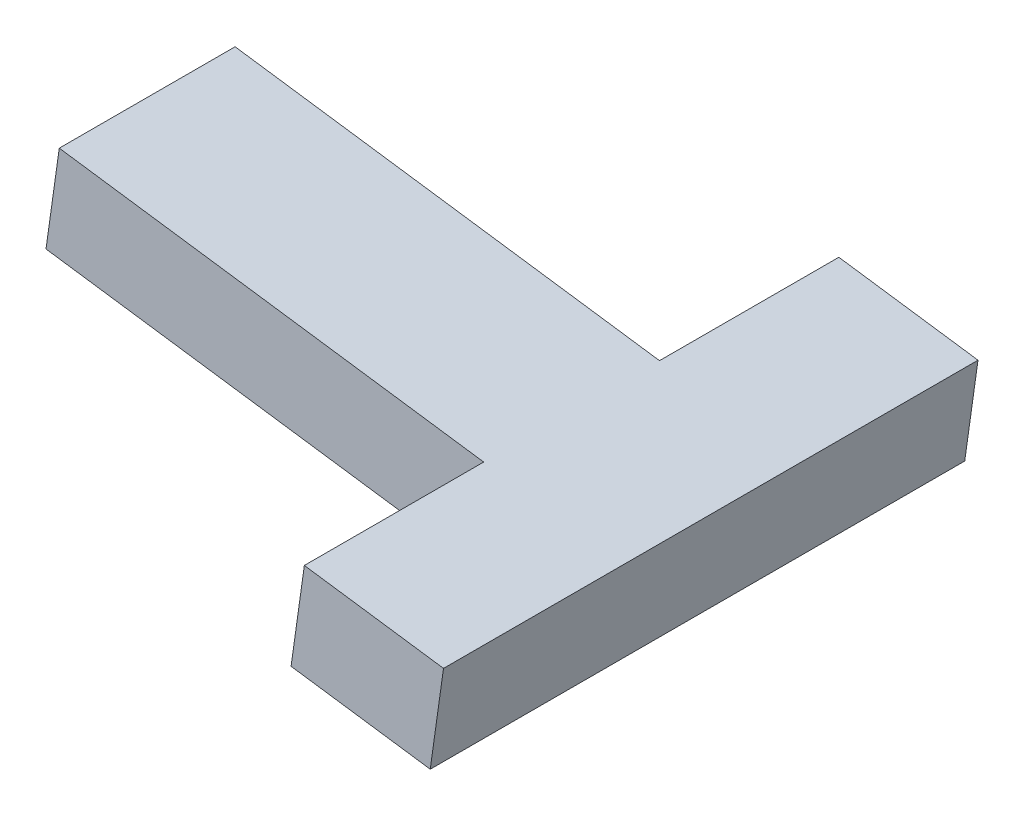
ISO-10303-21;
HEADER;
FILE_DESCRIPTION(('STEP AP214'),'2;1');
FILE_NAME('part.step','',(''),(''),'','','');
FILE_SCHEMA(('AUTOMOTIVE_DESIGN { 1 0 10303 214 1 1 1 1 }'));
ENDSEC;
DATA;
#1=APPLICATION_CONTEXT('core data for automotive mechanical design processes');
#2=APPLICATION_PROTOCOL_DEFINITION('international standard','automotive_design',2000,#1);
#3=PRODUCT_CONTEXT('',#1,'mechanical');
#4=PRODUCT('Part','Part','',(#3));
#5=PRODUCT_RELATED_PRODUCT_CATEGORY('part','',(#4));
#6=PRODUCT_DEFINITION_FORMATION('','',#4);
#7=PRODUCT_DEFINITION_CONTEXT('part definition',#1,'design');
#8=PRODUCT_DEFINITION('design','',#6,#7);
#9=PRODUCT_DEFINITION_SHAPE('','',#8);
#10=(LENGTH_UNIT() NAMED_UNIT(*) SI_UNIT(.MILLI.,.METRE.));
#11=(NAMED_UNIT(*) PLANE_ANGLE_UNIT() SI_UNIT($,.RADIAN.));
#12=(NAMED_UNIT(*) SI_UNIT($,.STERADIAN.) SOLID_ANGLE_UNIT());
#13=UNCERTAINTY_MEASURE_WITH_UNIT(LENGTH_MEASURE(1.E-05),#10,'distance_accuracy_value','');
#14=(GEOMETRIC_REPRESENTATION_CONTEXT(3) GLOBAL_UNCERTAINTY_ASSIGNED_CONTEXT((#13)) GLOBAL_UNIT_ASSIGNED_CONTEXT((#10,
#11,#12)) REPRESENTATION_CONTEXT('',''));
#15=CARTESIAN_POINT('',(0.,0.,0.));
#16=DIRECTION('',(0.,0.,1.));
#17=DIRECTION('',(1.,0.,0.));
#18=AXIS2_PLACEMENT_3D('',#15,#16,#17);
#19=CARTESIAN_POINT('',(740.156751872929,632.005300811222,2076.96507163557));
#20=DIRECTION('',(0.990268068741567,-0.139173100960088,0.));
#21=DIRECTION('',(-0.000106014336864278,-0.000754331202662602,-0.999999709872657));
#22=AXIS2_PLACEMENT_3D('',#19,#20,#21);
#23=PLANE('',#22);
#24=CARTESIAN_POINT('',(738.765021267107,622.102622996844,2076.97268908005));
#25=CARTESIAN_POINT('',(738.768008615167,622.12387908278,2105.15139850353));
#26=CARTESIAN_POINT('',(738.770995963227,622.145135168716,2133.33010792703));
#27=B_SPLINE_CURVE_WITH_KNOTS('',2,(#24,#25,#26),.UNSPECIFIED.,.F.,.F.,(3,3),(0.,1.),.UNSPECIFIED.);
#28=CARTESIAN_POINT('',(738.765021267107,622.102622996844,2076.97268908005));
#29=VERTEX_POINT('',#28);
#30=CARTESIAN_POINT('',(738.770995963227,622.145135168716,2133.33010792703));
#31=VERTEX_POINT('',#30);
#32=EDGE_CURVE('E122',#29,#31,#27,.T.);
#33=ORIENTED_EDGE('',*,*,#32,.F.);
#34=DIRECTION('',(-0.139173060582166,-0.990267781437723,0.000761744447259827));
#35=VECTOR('',#34,1.);
#36=CARTESIAN_POINT('',(740.156751872929,632.005300811222,2076.96507163557));
#37=LINE('',#36,#35);
#38=CARTESIAN_POINT('',(740.156751872929,632.005300811222,2076.96507163557));
#39=VERTEX_POINT('',#38);
#40=EDGE_CURVE('E33',#39,#29,#37,.T.);
#41=ORIENTED_EDGE('',*,*,#40,.F.);
#42=CARTESIAN_POINT('',(740.156751872929,632.005300811222,2076.96507163557));
#43=CARTESIAN_POINT('',(740.159739220989,632.026556897158,2105.14378105907));
#44=CARTESIAN_POINT('',(740.162726569049,632.047812983093,2133.32249048255));
#45=B_SPLINE_CURVE_WITH_KNOTS('',2,(#42,#43,#44),.UNSPECIFIED.,.F.,.F.,(3,3),(0.,1.),.UNSPECIFIED.);
#46=CARTESIAN_POINT('',(740.162726569049,632.047812983093,2133.32249048255));
#47=VERTEX_POINT('',#46);
#48=EDGE_CURVE('E182',#39,#47,#45,.T.);
#49=ORIENTED_EDGE('',*,*,#48,.T.);
#50=DIRECTION('',(-0.139173060582166,-0.990267781437723,0.000761744447259827));
#51=VECTOR('',#50,1.);
#52=CARTESIAN_POINT('',(740.162726569049,632.047812983093,2133.32249048255));
#53=LINE('',#52,#51);
#54=EDGE_CURVE('E11',#47,#31,#53,.T.);
#55=ORIENTED_EDGE('',*,*,#54,.T.);
#56=EDGE_LOOP('',(#33,#41,#49,#55));
#57=FACE_BOUND('',#56,.T.);
#58=ADVANCED_FACE('F17',(#57),#23,.T.);
#59=CARTESIAN_POINT('',(740.162726569049,632.047812983093,2133.32249048255));
#60=DIRECTION('',(0.000106014336864278,0.000754331202662602,0.999999709872657));
#61=DIRECTION('',(0.990268068741567,-0.139173100960088,0.));
#62=AXIS2_PLACEMENT_3D('',#59,#60,#61);
#63=PLANE('',#62);
#64=CARTESIAN_POINT('',(738.770995963227,622.145135168716,2133.33010792703));
#65=CARTESIAN_POINT('',(731.435176572686,623.176117349089,2133.33010792703));
#66=CARTESIAN_POINT('',(724.099357182145,624.207099529462,2133.33010792703));
#67=B_SPLINE_CURVE_WITH_KNOTS('',2,(#64,#65,#66),.UNSPECIFIED.,.F.,.F.,(3,3),(1.,2.),.UNSPECIFIED.);
#68=CARTESIAN_POINT('',(724.099357182145,624.207099529462,2133.33010792703));
#69=VERTEX_POINT('',#68);
#70=EDGE_CURVE('E130',#31,#69,#67,.T.);
#71=ORIENTED_EDGE('',*,*,#70,.F.);
#72=ORIENTED_EDGE('',*,*,#54,.F.);
#73=CARTESIAN_POINT('',(740.162726569049,632.047812983093,2133.32249048255));
#74=CARTESIAN_POINT('',(732.826907178508,633.078795163466,2133.32249048255));
#75=CARTESIAN_POINT('',(725.491087787966,634.109777343839,2133.32249048255));
#76=B_SPLINE_CURVE_WITH_KNOTS('',2,(#73,#74,#75),.UNSPECIFIED.,.F.,.F.,(3,3),(1.,2.),.UNSPECIFIED.);
#77=CARTESIAN_POINT('',(725.491087787966,634.109777343839,2133.32249048255));
#78=VERTEX_POINT('',#77);
#79=EDGE_CURVE('E194',#47,#78,#76,.T.);
#80=ORIENTED_EDGE('',*,*,#79,.T.);
#81=DIRECTION('',(-0.139173060582166,-0.990267781437723,0.000761744447259827));
#82=VECTOR('',#81,1.);
#83=CARTESIAN_POINT('',(725.491087787966,634.109777343839,2133.32249048255));
#84=LINE('',#83,#82);
#85=EDGE_CURVE('E25',#78,#69,#84,.T.);
#86=ORIENTED_EDGE('',*,*,#85,.T.);
#87=EDGE_LOOP('',(#71,#72,#80,#86));
#88=FACE_BOUND('',#87,.T.);
#89=ADVANCED_FACE('F193',(#88),#63,.T.);
#90=CARTESIAN_POINT('',(725.491087787966,634.109777343839,2133.32249048255));
#91=DIRECTION('',(-0.990268068741567,0.139173100960088,0.));
#92=DIRECTION('',(0.000106014336875907,0.000754331202660967,0.999999709872657));
#93=AXIS2_PLACEMENT_3D('',#90,#91,#92);
#94=PLANE('',#93);
#95=CARTESIAN_POINT('',(724.099357182145,624.207099529462,2133.33010792703));
#96=CARTESIAN_POINT('',(724.098354891075,624.199967857928,2123.87581326207));
#97=CARTESIAN_POINT('',(724.097352600004,624.192836186394,2114.4215185971));
#98=B_SPLINE_CURVE_WITH_KNOTS('',2,(#95,#96,#97),.UNSPECIFIED.,.F.,.F.,(3,3),(2.,3.),.UNSPECIFIED.);
#99=CARTESIAN_POINT('',(724.097352600004,624.192836186394,2114.4215185971));
#100=VERTEX_POINT('',#99);
#101=EDGE_CURVE('E138',#69,#100,#98,.T.);
#102=ORIENTED_EDGE('',*,*,#101,.F.);
#103=ORIENTED_EDGE('',*,*,#85,.F.);
#104=CARTESIAN_POINT('',(725.491087787966,634.109777343839,2133.32249048255));
#105=CARTESIAN_POINT('',(725.490085496896,634.102645672305,2123.86819581759));
#106=CARTESIAN_POINT('',(725.489083205826,634.095514000771,2114.41390115263));
#107=B_SPLINE_CURVE_WITH_KNOTS('',2,(#104,#105,#106),.UNSPECIFIED.,.F.,.F.,(3,3),(2.,3.),.UNSPECIFIED.);
#108=CARTESIAN_POINT('',(725.489083205826,634.095514000771,2114.41390115263));
#109=VERTEX_POINT('',#108);
#110=EDGE_CURVE('E203',#78,#109,#107,.T.);
#111=ORIENTED_EDGE('',*,*,#110,.T.);
#112=DIRECTION('',(-0.139173060582166,-0.990267781437723,0.000761744447259827));
#113=VECTOR('',#112,1.);
#114=CARTESIAN_POINT('',(725.489083205826,634.095514000771,2114.41390115263));
#115=LINE('',#114,#113);
#116=EDGE_CURVE('E191',#109,#100,#115,.T.);
#117=ORIENTED_EDGE('',*,*,#116,.T.);
#118=EDGE_LOOP('',(#102,#103,#111,#117));
#119=FACE_BOUND('',#118,.T.);
#120=ADVANCED_FACE('F198',(#119),#94,.T.);
#121=CARTESIAN_POINT('',(725.489083205826,634.095514000771,2114.41390115263));
#122=DIRECTION('',(0.000106014336864278,0.000754331202662602,0.999999709872657));
#123=DIRECTION('',(0.990268068741567,-0.139173100960088,0.));
#124=AXIS2_PLACEMENT_3D('',#121,#122,#123);
#125=PLANE('',#124);
#126=CARTESIAN_POINT('',(724.097352600004,624.192836186394,2114.4215185971));
#127=CARTESIAN_POINT('',(701.725129928298,627.337047034824,2114.4215185971));
#128=CARTESIAN_POINT('',(679.352907256593,630.481257883253,2114.4215185971));
#129=B_SPLINE_CURVE_WITH_KNOTS('',2,(#126,#127,#128),.UNSPECIFIED.,.F.,.F.,(3,3),(3.,4.),.UNSPECIFIED.);
#130=CARTESIAN_POINT('',(679.352907256593,630.481257883253,2114.4215185971));
#131=VERTEX_POINT('',#130);
#132=EDGE_CURVE('E146',#100,#131,#129,.T.);
#133=ORIENTED_EDGE('',*,*,#132,.F.);
#134=ORIENTED_EDGE('',*,*,#116,.F.);
#135=CARTESIAN_POINT('',(725.489083205826,634.095514000771,2114.41390115263));
#136=CARTESIAN_POINT('',(703.11686053412,637.239724849201,2114.41390115263));
#137=CARTESIAN_POINT('',(680.744637862414,640.383935697631,2114.41390115263));
#138=B_SPLINE_CURVE_WITH_KNOTS('',2,(#135,#136,#137),.UNSPECIFIED.,.F.,.F.,(3,3),(3.,4.),.UNSPECIFIED.);
#139=CARTESIAN_POINT('',(680.744637862414,640.383935697631,2114.41390115263));
#140=VERTEX_POINT('',#139);
#141=EDGE_CURVE('E219',#109,#140,#138,.T.);
#142=ORIENTED_EDGE('',*,*,#141,.T.);
#143=DIRECTION('',(-0.139173060582166,-0.990267781437723,0.000761744447259827));
#144=VECTOR('',#143,1.);
#145=CARTESIAN_POINT('',(680.744637862414,640.383935697631,2114.41390115263));
#146=LINE('',#145,#144);
#147=EDGE_CURVE('E189',#140,#131,#146,.T.);
#148=ORIENTED_EDGE('',*,*,#147,.T.);
#149=EDGE_LOOP('',(#133,#134,#142,#148));
#150=FACE_BOUND('',#149,.T.);
#151=ADVANCED_FACE('F239',(#150),#125,.T.);
#152=CARTESIAN_POINT('',(680.744637862414,640.383935697631,2114.41390115263));
#153=DIRECTION('',(-0.990268068741567,0.139173100960088,0.));
#154=DIRECTION('',(0.000106014336858348,0.000754331202663435,0.999999709872657));
#155=AXIS2_PLACEMENT_3D('',#152,#153,#154);
#156=PLANE('',#155);
#157=CARTESIAN_POINT('',(679.352907256593,630.481257883253,2114.4215185971));
#158=CARTESIAN_POINT('',(679.351924490673,630.474265140386,2105.15139850353));
#159=CARTESIAN_POINT('',(679.350941724754,630.467272397518,2095.88127840997));
#160=B_SPLINE_CURVE_WITH_KNOTS('',2,(#157,#158,#159),.UNSPECIFIED.,.F.,.F.,(3,3),(4.,5.),.UNSPECIFIED.);
#161=CARTESIAN_POINT('',(679.350941724754,630.467272397518,2095.88127840997));
#162=VERTEX_POINT('',#161);
#163=EDGE_CURVE('E154',#131,#162,#160,.T.);
#164=ORIENTED_EDGE('',*,*,#163,.F.);
#165=ORIENTED_EDGE('',*,*,#147,.F.);
#166=CARTESIAN_POINT('',(680.744637862414,640.383935697631,2114.41390115263));
#167=CARTESIAN_POINT('',(680.743655096495,640.376942954763,2105.14378105907));
#168=CARTESIAN_POINT('',(680.742672330575,640.369950211895,2095.87366096549));
#169=B_SPLINE_CURVE_WITH_KNOTS('',2,(#166,#167,#168),.UNSPECIFIED.,.F.,.F.,(3,3),(4.,5.),.UNSPECIFIED.);
#170=CARTESIAN_POINT('',(680.742672330575,640.369950211895,2095.87366096549));
#171=VERTEX_POINT('',#170);
#172=EDGE_CURVE('E104',#140,#171,#169,.T.);
#173=ORIENTED_EDGE('',*,*,#172,.T.);
#174=DIRECTION('',(-0.139173060582166,-0.990267781437723,0.000761744447259827));
#175=VECTOR('',#174,1.);
#176=CARTESIAN_POINT('',(680.742672330575,640.369950211895,2095.87366096549));
#177=LINE('',#176,#175);
#178=EDGE_CURVE('E96',#171,#162,#177,.T.);
#179=ORIENTED_EDGE('',*,*,#178,.T.);
#180=EDGE_LOOP('',(#164,#165,#173,#179));
#181=FACE_BOUND('',#180,.T.);
#182=ADVANCED_FACE('F236',(#181),#156,.T.);
#183=CARTESIAN_POINT('',(680.742672330575,640.369950211895,2095.87366096549));
#184=DIRECTION('',(-0.000106014336864278,-0.000754331202662602,-0.999999709872657));
#185=DIRECTION('',(-0.990268068741567,0.139173100960088,0.));
#186=AXIS2_PLACEMENT_3D('',#183,#184,#185);
#187=PLANE('',#186);
#188=CARTESIAN_POINT('',(679.350941724754,630.467272397518,2095.88127840997));
#189=CARTESIAN_POINT('',(701.72316439646,627.323061549088,2095.88127840997));
#190=CARTESIAN_POINT('',(724.095387068165,624.178850700658,2095.88127840997));
#191=B_SPLINE_CURVE_WITH_KNOTS('',2,(#188,#189,#190),.UNSPECIFIED.,.F.,.F.,(3,3),(5.,6.),.UNSPECIFIED.);
#192=CARTESIAN_POINT('',(724.095387068165,624.178850700658,2095.88127840997));
#193=VERTEX_POINT('',#192);
#194=EDGE_CURVE('E162',#162,#193,#191,.T.);
#195=ORIENTED_EDGE('',*,*,#194,.F.);
#196=ORIENTED_EDGE('',*,*,#178,.F.);
#197=CARTESIAN_POINT('',(680.742672330575,640.369950211895,2095.87366096549));
#198=CARTESIAN_POINT('',(703.114895002281,637.225739363465,2095.87366096549));
#199=CARTESIAN_POINT('',(725.487117673987,634.081528515036,2095.87366096549));
#200=B_SPLINE_CURVE_WITH_KNOTS('',2,(#197,#198,#199),.UNSPECIFIED.,.F.,.F.,(3,3),(5.,6.),.UNSPECIFIED.);
#201=CARTESIAN_POINT('',(725.487117673987,634.081528515036,2095.87366096549));
#202=VERTEX_POINT('',#201);
#203=EDGE_CURVE('E99',#171,#202,#200,.T.);
#204=ORIENTED_EDGE('',*,*,#203,.T.);
#205=DIRECTION('',(-0.139173060582166,-0.990267781437723,0.000761744447259827));
#206=VECTOR('',#205,1.);
#207=CARTESIAN_POINT('',(725.487117673987,634.081528515036,2095.87366096549));
#208=LINE('',#207,#206);
#209=EDGE_CURVE('E85',#202,#193,#208,.T.);
#210=ORIENTED_EDGE('',*,*,#209,.T.);
#211=EDGE_LOOP('',(#195,#196,#204,#210));
#212=FACE_BOUND('',#211,.T.);
#213=ADVANCED_FACE('F100',(#212),#187,.T.);
#214=CARTESIAN_POINT('',(725.487117673987,634.081528515036,2095.87366096549));
#215=DIRECTION('',(-0.990268068741567,0.139173100960088,0.));
#216=DIRECTION('',(0.000106014336864278,0.000754331202662602,0.999999709872657));
#217=AXIS2_PLACEMENT_3D('',#214,#215,#216);
#218=PLANE('',#217);
#219=CARTESIAN_POINT('',(724.095387068165,624.178850700658,2095.88127840997));
#220=CARTESIAN_POINT('',(724.094384777095,624.171719029124,2086.426983745));
#221=CARTESIAN_POINT('',(724.093382486025,624.16458735759,2076.97268908005));
#222=B_SPLINE_CURVE_WITH_KNOTS('',2,(#219,#220,#221),.UNSPECIFIED.,.F.,.F.,(3,3),(6.,7.),.UNSPECIFIED.);
#223=CARTESIAN_POINT('',(724.093382486025,624.16458735759,2076.97268908005));
#224=VERTEX_POINT('',#223);
#225=EDGE_CURVE('E92',#193,#224,#222,.T.);
#226=ORIENTED_EDGE('',*,*,#225,.F.);
#227=ORIENTED_EDGE('',*,*,#209,.F.);
#228=CARTESIAN_POINT('',(725.487117673987,634.081528515036,2095.87366096549));
#229=CARTESIAN_POINT('',(725.486115382917,634.074396843501,2086.41936630053));
#230=CARTESIAN_POINT('',(725.485113091847,634.067265171967,2076.96507163557));
#231=B_SPLINE_CURVE_WITH_KNOTS('',2,(#228,#229,#230),.UNSPECIFIED.,.F.,.F.,(3,3),(6.,7.),.UNSPECIFIED.);
#232=CARTESIAN_POINT('',(725.485113091847,634.067265171967,2076.96507163557));
#233=VERTEX_POINT('',#232);
#234=EDGE_CURVE('E89',#202,#233,#231,.T.);
#235=ORIENTED_EDGE('',*,*,#234,.T.);
#236=DIRECTION('',(-0.139173060582166,-0.990267781437723,0.000761744447259827));
#237=VECTOR('',#236,1.);
#238=CARTESIAN_POINT('',(725.485113091847,634.067265171967,2076.96507163557));
#239=LINE('',#238,#237);
#240=EDGE_CURVE('E61',#233,#224,#239,.T.);
#241=ORIENTED_EDGE('',*,*,#240,.T.);
#242=EDGE_LOOP('',(#226,#227,#235,#241));
#243=FACE_BOUND('',#242,.T.);
#244=ADVANCED_FACE('F87',(#243),#218,.T.);
#245=CARTESIAN_POINT('',(725.485113091847,634.067265171967,2076.96507163557));
#246=DIRECTION('',(-0.000106014336864278,-0.000754331202662602,-0.999999709872657));
#247=DIRECTION('',(-0.990268068741567,0.139173100960088,0.));
#248=AXIS2_PLACEMENT_3D('',#245,#246,#247);
#249=PLANE('',#248);
#250=CARTESIAN_POINT('',(724.093382486025,624.16458735759,2076.97268908005));
#251=CARTESIAN_POINT('',(731.429201876566,623.133605177217,2076.97268908005));
#252=CARTESIAN_POINT('',(738.765021267107,622.102622996844,2076.97268908005));
#253=B_SPLINE_CURVE_WITH_KNOTS('',2,(#250,#251,#252),.UNSPECIFIED.,.F.,.F.,(3,3),(7.,8.),.UNSPECIFIED.);
#254=EDGE_CURVE('E175',#224,#29,#253,.T.);
#255=ORIENTED_EDGE('',*,*,#254,.F.);
#256=ORIENTED_EDGE('',*,*,#240,.F.);
#257=CARTESIAN_POINT('',(725.485113091847,634.067265171967,2076.96507163557));
#258=CARTESIAN_POINT('',(732.820932482388,633.036282991595,2076.96507163557));
#259=CARTESIAN_POINT('',(740.156751872929,632.005300811222,2076.96507163557));
#260=B_SPLINE_CURVE_WITH_KNOTS('',2,(#257,#258,#259),.UNSPECIFIED.,.F.,.F.,(3,3),(7.,8.),.UNSPECIFIED.);
#261=EDGE_CURVE('E108',#233,#39,#260,.T.);
#262=ORIENTED_EDGE('',*,*,#261,.T.);
#263=ORIENTED_EDGE('',*,*,#40,.T.);
#264=EDGE_LOOP('',(#255,#256,#262,#263));
#265=FACE_BOUND('',#264,.T.);
#266=ADVANCED_FACE('F294',(#265),#249,.T.);
#267=CARTESIAN_POINT('',(740.159739220989,632.026556897158,2105.14378105907));
#268=DIRECTION('',(0.139173060582166,0.990267781437723,-0.000761744447259827));
#269=DIRECTION('',(0.000106014336864278,0.000754331202662602,0.999999709872657));
#270=AXIS2_PLACEMENT_3D('',#267,#268,#269);
#271=PLANE('',#270);
#272=ORIENTED_EDGE('',*,*,#48,.F.);
#273=ORIENTED_EDGE('',*,*,#261,.F.);
#274=ORIENTED_EDGE('',*,*,#234,.F.);
#275=ORIENTED_EDGE('',*,*,#203,.F.);
#276=ORIENTED_EDGE('',*,*,#172,.F.);
#277=ORIENTED_EDGE('',*,*,#141,.F.);
#278=ORIENTED_EDGE('',*,*,#110,.F.);
#279=ORIENTED_EDGE('',*,*,#79,.F.);
#280=EDGE_LOOP('',(#272,#273,#274,#275,#276,#277,#278,#279));
#281=FACE_BOUND('',#280,.T.);
#282=ADVANCED_FACE('F107',(#281),#271,.T.);
#283=CARTESIAN_POINT('',(738.768008615167,622.12387908278,2105.15139850353));
#284=DIRECTION('',(0.139173060582166,0.990267781437723,-0.000761744447259827));
#285=DIRECTION('',(0.000106014336864278,0.000754331202662602,0.999999709872657));
#286=AXIS2_PLACEMENT_3D('',#283,#284,#285);
#287=PLANE('',#286);
#288=ORIENTED_EDGE('',*,*,#32,.T.);
#289=ORIENTED_EDGE('',*,*,#70,.T.);
#290=ORIENTED_EDGE('',*,*,#101,.T.);
#291=ORIENTED_EDGE('',*,*,#132,.T.);
#292=ORIENTED_EDGE('',*,*,#163,.T.);
#293=ORIENTED_EDGE('',*,*,#194,.T.);
#294=ORIENTED_EDGE('',*,*,#225,.T.);
#295=ORIENTED_EDGE('',*,*,#254,.T.);
#296=EDGE_LOOP('',(#288,#289,#290,#291,#292,#293,#294,#295));
#297=FACE_BOUND('',#296,.T.);
#298=ADVANCED_FACE('F201',(#297),#287,.F.);
#299=CLOSED_SHELL('',(#58,#89,#120,#151,#182,#213,#244,#266,#282,#298));
#300=MANIFOLD_SOLID_BREP('B1',#299);
#301=ADVANCED_BREP_SHAPE_REPRESENTATION('',(#18,#300),#14);
#302=SHAPE_DEFINITION_REPRESENTATION(#9,#301);
ENDSEC;
END-ISO-10303-21;
